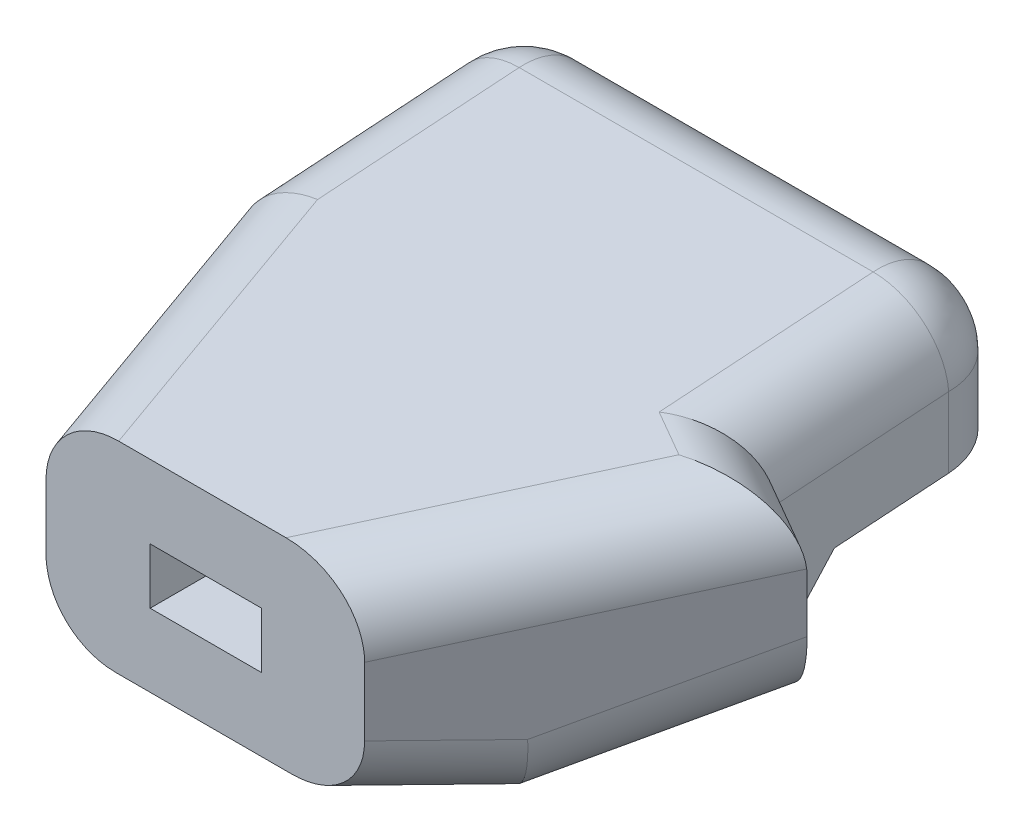
ISO-10303-21;
HEADER;
FILE_DESCRIPTION(('STEP AP214'),'2;1');
FILE_NAME('part.step','',(''),(''),'','','');
FILE_SCHEMA(('AUTOMOTIVE_DESIGN { 1 0 10303 214 1 1 1 1 }'));
ENDSEC;
DATA;
#1=APPLICATION_CONTEXT('core data for automotive mechanical design processes');
#2=APPLICATION_PROTOCOL_DEFINITION('international standard','automotive_design',2000,#1);
#3=PRODUCT_CONTEXT('',#1,'mechanical');
#4=PRODUCT('Part','Part','',(#3));
#5=PRODUCT_RELATED_PRODUCT_CATEGORY('part','',(#4));
#6=PRODUCT_DEFINITION_FORMATION('','',#4);
#7=PRODUCT_DEFINITION_CONTEXT('part definition',#1,'design');
#8=PRODUCT_DEFINITION('design','',#6,#7);
#9=PRODUCT_DEFINITION_SHAPE('','',#8);
#10=(LENGTH_UNIT() NAMED_UNIT(*) SI_UNIT(.MILLI.,.METRE.));
#11=(NAMED_UNIT(*) PLANE_ANGLE_UNIT() SI_UNIT($,.RADIAN.));
#12=(NAMED_UNIT(*) SI_UNIT($,.STERADIAN.) SOLID_ANGLE_UNIT());
#13=UNCERTAINTY_MEASURE_WITH_UNIT(LENGTH_MEASURE(1.E-05),#10,'distance_accuracy_value','');
#14=(GEOMETRIC_REPRESENTATION_CONTEXT(3) GLOBAL_UNCERTAINTY_ASSIGNED_CONTEXT((#13)) GLOBAL_UNIT_ASSIGNED_CONTEXT((#10,
#11,#12)) REPRESENTATION_CONTEXT('',''));
#15=CARTESIAN_POINT('',(0.,0.,0.));
#16=DIRECTION('',(0.,0.,1.));
#17=DIRECTION('',(1.,0.,0.));
#18=AXIS2_PLACEMENT_3D('',#15,#16,#17);
#19=CARTESIAN_POINT('',(-44.45,48.26,-50.8));
#20=DIRECTION('',(1.,0.,0.));
#21=DIRECTION('',(0.,0.,-1.));
#22=AXIS2_PLACEMENT_3D('',#19,#20,#21);
#23=PLANE('',#22);
#24=DIRECTION('',(0.,0.741365955623749,-0.671100975891173));
#25=VECTOR('',#24,1.);
#26=CARTESIAN_POINT('',(-44.45,27.062088622232,-74.2173550484524));
#27=LINE('',#26,#25);
#28=CARTESIAN_POINT('',(-44.45,15.2004808970908,-63.4799635353998));
#29=VERTEX_POINT('',#28);
#30=CARTESIAN_POINT('',(-44.45,20.6329834358397,-68.3975858346573));
#31=VERTEX_POINT('',#30);
#32=EDGE_CURVE('E282',#29,#31,#27,.T.);
#33=ORIENTED_EDGE('',*,*,#32,.F.);
#34=CARTESIAN_POINT('',(-44.45,32.1617140550632,-93.3781587201701));
#35=DIRECTION('',(1.,0.,0.));
#36=DIRECTION('',(0.,-0.268871544476507,0.963176044433632));
#37=AXIS2_PLACEMENT_3D('',#34,#35,#36);
#38=ELLIPSE('',#37,44.0636100522988,12.7);
#39=CARTESIAN_POINT('',(-44.45,21.3334287185706,-50.8));
#40=VERTEX_POINT('',#39);
#41=EDGE_CURVE('E381',#29,#40,#38,.F.);
#42=ORIENTED_EDGE('',*,*,#41,.T.);
#43=DIRECTION('',(0.,-1.,0.));
#44=VECTOR('',#43,1.);
#45=CARTESIAN_POINT('',(-44.45,48.26,-50.8));
#46=LINE('',#45,#44);
#47=CARTESIAN_POINT('',(-44.45,32.1241080736787,-50.8));
#48=VERTEX_POINT('',#47);
#49=EDGE_CURVE('E294',#48,#40,#46,.T.);
#50=ORIENTED_EDGE('',*,*,#49,.F.);
#51=DIRECTION('',(0.,-0.0669235621427186,0.997758105369297));
#52=VECTOR('',#51,1.);
#53=CARTESIAN_POINT('',(-44.45,35.5884720618099,-102.449929239213));
#54=LINE('',#53,#52);
#55=CARTESIAN_POINT('',(-44.45,34.6796249909718,-88.9));
#56=VERTEX_POINT('',#55);
#57=EDGE_CURVE('E323',#48,#56,#54,.F.);
#58=ORIENTED_EDGE('',*,*,#57,.T.);
#59=DIRECTION('',(0.,-1.,0.));
#60=VECTOR('',#59,1.);
#61=CARTESIAN_POINT('',(-44.45,48.26,-88.9));
#62=LINE('',#61,#60);
#63=CARTESIAN_POINT('',(-44.45,22.008161027569,-88.9));
#64=VERTEX_POINT('',#63);
#65=EDGE_CURVE('E325',#56,#64,#62,.T.);
#66=ORIENTED_EDGE('',*,*,#65,.T.);
#67=DIRECTION('',(0.,0.0669235621427186,-0.997758105369297));
#68=VECTOR('',#67,1.);
#69=CARTESIAN_POINT('',(-44.45,19.5816654348561,-52.7235687438587));
#70=LINE('',#69,#68);
#71=EDGE_CURVE('E279',#31,#64,#70,.T.);
#72=ORIENTED_EDGE('',*,*,#71,.F.);
#73=EDGE_LOOP('',(#33,#42,#50,#58,#66,#72));
#74=FACE_BOUND('',#73,.T.);
#75=ADVANCED_FACE('F52',(#74),#23,.F.);
#76=CARTESIAN_POINT('',(-28.575,48.26,0.));
#77=DIRECTION('',(0.95447997803503,0.,-0.298274993135947));
#78=DIRECTION('',(-0.298274993135947,0.,-0.95447997803503));
#79=AXIS2_PLACEMENT_3D('',#76,#77,#78);
#80=PLANE('',#79);
#81=ORIENTED_EDGE('',*,*,#49,.T.);
#82=DIRECTION('',(-0.288219689329278,0.257461795372023,-0.922303005853689));
#83=VECTOR('',#82,1.);
#84=CARTESIAN_POINT('',(-35.4555907010625,13.29887434165,-22.0178902434001));
#85=LINE('',#84,#83);
#86=CARTESIAN_POINT('',(-35.1883635531592,13.0601648300568,-21.1627633701095));
#87=VERTEX_POINT('',#86);
#88=EDGE_CURVE('E385',#40,#87,#85,.F.);
#89=ORIENTED_EDGE('',*,*,#88,.T.);
#90=DIRECTION('',(-0.292654151843761,-0.193219752801737,-0.936493285900035));
#91=VECTOR('',#90,1.);
#92=CARTESIAN_POINT('',(-29.2640722899567,16.971573864201,-2.2050313278613));
#93=LINE('',#92,#91);
#94=CARTESIAN_POINT('',(-28.575,17.4265217154074,0.));
#95=VERTEX_POINT('',#94);
#96=EDGE_CURVE('E383',#87,#95,#93,.F.);
#97=ORIENTED_EDGE('',*,*,#96,.T.);
#98=DIRECTION('',(0.,-1.,0.));
#99=VECTOR('',#98,1.);
#100=CARTESIAN_POINT('',(-28.575,48.26,0.));
#101=LINE('',#100,#99);
#102=CARTESIAN_POINT('',(-28.575,28.9708344476093,0.));
#103=VERTEX_POINT('',#102);
#104=EDGE_CURVE('E291',#103,#95,#101,.T.);
#105=ORIENTED_EDGE('',*,*,#104,.F.);
#106=DIRECTION('',(0.297665602820913,-0.0638899303899297,0.952529929026922));
#107=VECTOR('',#106,1.);
#108=CARTESIAN_POINT('',(-44.6872370991244,32.4291100996618,-51.5591587171979));
#109=LINE('',#108,#107);
#110=CARTESIAN_POINT('',(-44.4474694857825,32.3776471963871,-50.791902354504));
#111=VERTEX_POINT('',#110);
#112=EDGE_CURVE('E341',#103,#111,#109,.F.);
#113=ORIENTED_EDGE('',*,*,#112,.T.);
#114=CARTESIAN_POINT('',(-31.75,29.3982233618993,-10.16));
#115=DIRECTION('',(0.95447997803503,0.,-0.298274993135947));
#116=DIRECTION('',(-0.297541229968866,0.0700998795093561,-0.952131935900371));
#117=AXIS2_PLACEMENT_3D('',#114,#115,#116);
#118=ELLIPSE('',#117,42.6738289481605,12.7);
#119=EDGE_CURVE('E343',#111,#48,#118,.F.);
#120=ORIENTED_EDGE('',*,*,#119,.T.);
#121=EDGE_LOOP('',(#81,#89,#97,#105,#113,#120));
#122=FACE_BOUND('',#121,.T.);
#123=ADVANCED_FACE('F501',(#122),#80,.F.);
#124=CARTESIAN_POINT('',(28.575,48.26,0.));
#125=DIRECTION('',(0.,0.,-1.));
#126=DIRECTION('',(-1.,0.,0.));
#127=AXIS2_PLACEMENT_3D('',#124,#125,#126);
#128=PLANE('',#127);
#129=DIRECTION('',(0.,1.,0.));
#130=VECTOR('',#129,1.);
#131=CARTESIAN_POINT('',(10.1041684211454,0.,0.));
#132=LINE('',#131,#130);
#133=CARTESIAN_POINT('',(10.1041684211454,18.3063755872149,0.));
#134=VERTEX_POINT('',#133);
#135=CARTESIAN_POINT('',(10.1041684211454,28.3063755872149,0.));
#136=VERTEX_POINT('',#135);
#137=EDGE_CURVE('E246',#134,#136,#132,.T.);
#138=ORIENTED_EDGE('',*,*,#137,.F.);
#139=DIRECTION('',(1.,0.,0.));
#140=VECTOR('',#139,1.);
#141=CARTESIAN_POINT('',(0.,18.3063755872149,0.));
#142=LINE('',#141,#140);
#143=CARTESIAN_POINT('',(-9.89583157885465,18.3063755872149,0.));
#144=VERTEX_POINT('',#143);
#145=EDGE_CURVE('E69',#144,#134,#142,.T.);
#146=ORIENTED_EDGE('',*,*,#145,.F.);
#147=DIRECTION('',(0.,1.,0.));
#148=VECTOR('',#147,1.);
#149=CARTESIAN_POINT('',(-9.89583157885465,0.,0.));
#150=LINE('',#149,#148);
#151=CARTESIAN_POINT('',(-9.89583157885465,28.3063755872149,0.));
#152=VERTEX_POINT('',#151);
#153=EDGE_CURVE('E237',#144,#152,#150,.T.);
#154=ORIENTED_EDGE('',*,*,#153,.T.);
#155=DIRECTION('',(1.,0.,0.));
#156=VECTOR('',#155,1.);
#157=CARTESIAN_POINT('',(0.,28.3063755872149,0.));
#158=LINE('',#157,#156);
#159=EDGE_CURVE('E240',#152,#136,#158,.T.);
#160=ORIENTED_EDGE('',*,*,#159,.T.);
#161=EDGE_LOOP('',(#138,#146,#154,#160));
#162=FACE_BOUND('',#161,.T.);
#163=ORIENTED_EDGE('',*,*,#104,.T.);
#164=CARTESIAN_POINT('',(-15.2693253999468,18.2080908847934,0.));
#165=DIRECTION('',(0.,0.,-1.));
#166=DIRECTION('',(0.834520233187556,0.550977295721509,0.));
#167=AXIS2_PLACEMENT_3D('',#164,#165,#166);
#168=ELLIPSE('',#167,13.5612290992502,12.7);
#169=CARTESIAN_POINT('',(-16.0712770544389,5.24059466848969,0.));
#170=VERTEX_POINT('',#169);
#171=EDGE_CURVE('E397',#95,#170,#168,.F.);
#172=ORIENTED_EDGE('',*,*,#171,.T.);
#173=DIRECTION('',(-1.,0.,0.));
#174=VECTOR('',#173,1.);
#175=CARTESIAN_POINT('',(82.55,5.24059466848969,0.));
#176=LINE('',#175,#174);
#177=CARTESIAN_POINT('',(15.4471999259788,5.24059466848969,0.));
#178=VERTEX_POINT('',#177);
#179=EDGE_CURVE('E255',#178,#170,#176,.T.);
#180=ORIENTED_EDGE('',*,*,#179,.F.);
#181=CARTESIAN_POINT('',(14.0036869478931,18.2080908847934,0.));
#182=DIRECTION('',(0.,0.,-1.));
#183=DIRECTION('',(0.938837131961839,-0.344361495596806,0.));
#184=AXIS2_PLACEMENT_3D('',#181,#182,#183);
#185=ELLIPSE('',#184,14.8050370544065,12.7);
#186=CARTESIAN_POINT('',(28.575,16.9234606655006,0.));
#187=VERTEX_POINT('',#186);
#188=EDGE_CURVE('E395',#178,#187,#185,.F.);
#189=ORIENTED_EDGE('',*,*,#188,.T.);
#190=DIRECTION('',(0.,-1.,0.));
#191=VECTOR('',#190,1.);
#192=CARTESIAN_POINT('',(28.575,48.26,0.));
#193=LINE('',#192,#191);
#194=CARTESIAN_POINT('',(28.575,29.1343758145459,0.));
#195=VERTEX_POINT('',#194);
#196=EDGE_CURVE('E289',#195,#187,#193,.T.);
#197=ORIENTED_EDGE('',*,*,#196,.F.);
#198=CARTESIAN_POINT('',(14.0036869478931,28.7167521839545,0.));
#199=DIRECTION('',(0.,0.,-1.));
#200=DIRECTION('',(-0.992965534941179,-0.118403743264215,0.));
#201=AXIS2_PLACEMENT_3D('',#198,#199,#200);
#202=ELLIPSE('',#201,14.5961910681332,12.7);
#203=CARTESIAN_POINT('',(14.4817721449502,41.4452882205517,0.));
#204=VERTEX_POINT('',#203);
#205=EDGE_CURVE('E319',#195,#204,#202,.F.);
#206=ORIENTED_EDGE('',*,*,#205,.T.);
#207=DIRECTION('',(-1.,0.,0.));
#208=VECTOR('',#207,1.);
#209=CARTESIAN_POINT('',(82.55,41.4452882205517,0.));
#210=LINE('',#209,#208);
#211=CARTESIAN_POINT('',(-15.5349282872007,41.4452882205517,0.));
#212=VERTEX_POINT('',#211);
#213=EDGE_CURVE('E271',#204,#212,#210,.T.);
#214=ORIENTED_EDGE('',*,*,#213,.T.);
#215=CARTESIAN_POINT('',(-15.2693253999468,28.7167521839545,0.));
#216=DIRECTION('',(0.,0.,-1.));
#217=DIRECTION('',(-0.977732072803991,0.209857079486041,0.));
#218=AXIS2_PLACEMENT_3D('',#215,#216,#217);
#219=ELLIPSE('',#218,13.3329143924895,12.7);
#220=EDGE_CURVE('E317',#212,#103,#219,.F.);
#221=ORIENTED_EDGE('',*,*,#220,.T.);
#222=EDGE_LOOP('',(#163,#172,#180,#189,#197,#206,#214,#221));
#223=FACE_BOUND('',#222,.T.);
#224=ADVANCED_FACE('F420',(#162,#223),#128,.F.);
#225=CARTESIAN_POINT('',(57.15,48.26,-50.8));
#226=DIRECTION('',(-0.871575537124549,0.,-0.490261239632559));
#227=DIRECTION('',(-0.490261239632559,0.,0.871575537124549));
#228=AXIS2_PLACEMENT_3D('',#225,#226,#227);
#229=PLANE('',#228);
#230=DIRECTION('',(-0.482521588682802,0.176986881195609,0.857816157658315));
#231=VECTOR('',#230,1.);
#232=CARTESIAN_POINT('',(43.8602166520565,11.3169077420727,-27.1737184925448));
#233=LINE('',#232,#231);
#234=CARTESIAN_POINT('',(39.1075526472764,13.0601648300568,-18.7245380396025));
#235=VERTEX_POINT('',#234);
#236=EDGE_CURVE('E77',#187,#235,#233,.F.);
#237=ORIENTED_EDGE('',*,*,#236,.T.);
#238=DIRECTION('',(-0.476364625502872,-0.23640472157252,0.84687044533844));
#239=VECTOR('',#238,1.);
#240=CARTESIAN_POINT('',(55.4693780752367,21.1800221360687,-47.8122276893097));
#241=LINE('',#240,#239);
#242=CARTESIAN_POINT('',(57.15,22.0140617286873,-50.8));
#243=VERTEX_POINT('',#242);
#244=EDGE_CURVE('E61',#235,#243,#241,.F.);
#245=ORIENTED_EDGE('',*,*,#244,.T.);
#246=DIRECTION('',(0.,-1.,0.));
#247=VECTOR('',#246,1.);
#248=CARTESIAN_POINT('',(57.15,48.26,-50.8));
#249=LINE('',#248,#247);
#250=CARTESIAN_POINT('',(57.15,31.3816660637385,-50.8));
#251=VERTEX_POINT('',#250);
#252=EDGE_CURVE('E286',#251,#243,#249,.T.);
#253=ORIENTED_EDGE('',*,*,#252,.F.);
#254=CARTESIAN_POINT('',(50.9236822566665,31.3816660637385,-39.7309906785182));
#255=DIRECTION('',(-0.871575537124549,0.,-0.490261239632559));
#256=DIRECTION('',(0.,-1.,0.));
#257=AXIS2_PLACEMENT_3D('',#254,#255,#256);
#258=ELLIPSE('',#257,12.7068646603648,12.7);
#259=CARTESIAN_POINT('',(57.1241369132409,32.5386477238328,-50.754021179095));
#260=VERTEX_POINT('',#259);
#261=EDGE_CURVE('E313',#251,#260,#258,.F.);
#262=ORIENTED_EDGE('',*,*,#261,.T.);
#263=DIRECTION('',(0.489425629375078,0.0583603604840991,-0.870090007777917));
#264=VECTOR('',#263,1.);
#265=CARTESIAN_POINT('',(28.9266372824396,29.1763059410679,-0.625132946559234));
#266=LINE('',#265,#264);
#267=EDGE_CURVE('E315',#260,#195,#266,.F.);
#268=ORIENTED_EDGE('',*,*,#267,.T.);
#269=ORIENTED_EDGE('',*,*,#196,.T.);
#270=EDGE_LOOP('',(#237,#245,#253,#262,#268,#269));
#271=FACE_BOUND('',#270,.T.);
#272=ADVANCED_FACE('F475',(#271),#229,.F.);
#273=CARTESIAN_POINT('',(57.15,48.26,-50.8));
#274=DIRECTION('',(-0.490261239632559,0.,0.871575537124549));
#275=DIRECTION('',(0.871575537124549,0.,0.490261239632559));
#276=AXIS2_PLACEMENT_3D('',#273,#274,#275);
#277=PLANE('',#276);
#278=ORIENTED_EDGE('',*,*,#252,.T.);
#279=CARTESIAN_POINT('',(46.0809906785182,22.0140617286873,-57.0263177433335));
#280=DIRECTION('',(-0.490261239632559,0.,0.871575537124549));
#281=DIRECTION('',(0.,1.,0.));
#282=AXIS2_PLACEMENT_3D('',#279,#280,#281);
#283=ELLIPSE('',#282,13.0704872066449,12.7);
#284=CARTESIAN_POINT('',(44.6219037926469,9.0576272161988,-57.8470541166361));
#285=VERTEX_POINT('',#284);
#286=EDGE_CURVE('E12',#243,#285,#283,.F.);
#287=ORIENTED_EDGE('',*,*,#286,.T.);
#288=DIRECTION('',(0.863526210364251,-0.13559298459543,0.485733493329891));
#289=VECTOR('',#288,1.);
#290=CARTESIAN_POINT('',(52.329534026568,7.84735638129908,-53.5115121100555));
#291=LINE('',#290,#289);
#292=CARTESIAN_POINT('',(44.45,9.08461996758088,-57.94375));
#293=VERTEX_POINT('',#292);
#294=EDGE_CURVE('E258',#293,#285,#291,.T.);
#295=ORIENTED_EDGE('',*,*,#294,.F.);
#296=DIRECTION('',(0.,-1.,0.));
#297=VECTOR('',#296,1.);
#298=CARTESIAN_POINT('',(44.45,48.26,-57.94375));
#299=LINE('',#298,#297);
#300=CARTESIAN_POINT('',(44.45,31.8608254857309,-57.94375));
#301=VERTEX_POINT('',#300);
#302=EDGE_CURVE('E284',#301,#293,#299,.T.);
#303=ORIENTED_EDGE('',*,*,#302,.F.);
#304=DIRECTION('',(-0.871104683754771,0.0328659855718789,-0.489996384612059));
#305=VECTOR('',#304,1.);
#306=CARTESIAN_POINT('',(56.76432975166,31.3962170506104,-51.0169395146912));
#307=LINE('',#306,#305);
#308=EDGE_CURVE('E321',#301,#251,#307,.F.);
#309=ORIENTED_EDGE('',*,*,#308,.T.);
#310=EDGE_LOOP('',(#278,#287,#295,#303,#309));
#311=FACE_BOUND('',#310,.T.);
#312=ADVANCED_FACE('F471',(#311),#277,.F.);
#313=CARTESIAN_POINT('',(44.45,48.26,-57.94375));
#314=DIRECTION('',(-1.,0.,0.));
#315=DIRECTION('',(0.,0.,1.));
#316=AXIS2_PLACEMENT_3D('',#313,#314,#315);
#317=PLANE('',#316);
#318=DIRECTION('',(0.,-0.0669235621427186,0.997758105369297));
#319=VECTOR('',#318,1.);
#320=CARTESIAN_POINT('',(44.45,20.0586788152768,-59.835323579464));
#321=LINE('',#320,#319);
#322=CARTESIAN_POINT('',(44.45,22.008161027569,-88.9));
#323=VERTEX_POINT('',#322);
#324=CARTESIAN_POINT('',(44.45,20.6329834358397,-68.3975858346573));
#325=VERTEX_POINT('',#324);
#326=EDGE_CURVE('E277',#323,#325,#321,.T.);
#327=ORIENTED_EDGE('',*,*,#326,.F.);
#328=DIRECTION('',(0.,-1.,0.));
#329=VECTOR('',#328,1.);
#330=CARTESIAN_POINT('',(44.45,48.26,-88.9));
#331=LINE('',#330,#329);
#332=CARTESIAN_POINT('',(44.45,34.6796249909718,-88.9));
#333=VERTEX_POINT('',#332);
#334=EDGE_CURVE('E339',#323,#333,#331,.F.);
#335=ORIENTED_EDGE('',*,*,#334,.T.);
#336=DIRECTION('',(0.,0.0669235621427186,-0.997758105369297));
#337=VECTOR('',#336,1.);
#338=CARTESIAN_POINT('',(44.45,32.6602755940782,-58.7936792392125));
#339=LINE('',#338,#337);
#340=CARTESIAN_POINT('',(44.45,32.6016034681345,-57.9189411448069));
#341=VERTEX_POINT('',#340);
#342=EDGE_CURVE('E337',#333,#341,#339,.F.);
#343=ORIENTED_EDGE('',*,*,#342,.T.);
#344=CARTESIAN_POINT('',(44.45,31.6259121935233,-43.3724369478931));
#345=DIRECTION('',(-1.,0.,0.));
#346=DIRECTION('',(0.,-0.0669235621427186,0.997758105369297));
#347=AXIS2_PLACEMENT_3D('',#344,#345,#346);
#348=ELLIPSE('',#347,14.5791892029078,12.7);
#349=EDGE_CURVE('E345',#341,#301,#348,.T.);
#350=ORIENTED_EDGE('',*,*,#349,.T.);
#351=ORIENTED_EDGE('',*,*,#302,.T.);
#352=DIRECTION('',(0.,-0.741365955623749,0.671100975891173));
#353=VECTOR('',#352,1.);
#354=CARTESIAN_POINT('',(44.45,30.616328677508,-77.4347323120743));
#355=LINE('',#354,#353);
#356=EDGE_CURVE('E297',#325,#293,#355,.T.);
#357=ORIENTED_EDGE('',*,*,#356,.F.);
#358=EDGE_LOOP('',(#327,#335,#343,#350,#351,#357));
#359=FACE_BOUND('',#358,.T.);
#360=ADVANCED_FACE('F464',(#359),#317,.F.);
#361=CARTESIAN_POINT('',(-44.45,48.26,-101.6));
#362=DIRECTION('',(0.,0.,1.));
#363=DIRECTION('',(1.,0.,0.));
#364=AXIS2_PLACEMENT_3D('',#361,#362,#363);
#365=PLANE('',#364);
#366=DIRECTION('',(-1.,0.,0.));
#367=VECTOR('',#366,1.);
#368=CARTESIAN_POINT('',(82.55,22.86,-101.6));
#369=LINE('',#368,#367);
#370=CARTESIAN_POINT('',(31.75,22.86,-101.6));
#371=VERTEX_POINT('',#370);
#372=CARTESIAN_POINT('',(-31.75,22.86,-101.6));
#373=VERTEX_POINT('',#372);
#374=EDGE_CURVE('E268',#371,#373,#369,.T.);
#375=ORIENTED_EDGE('',*,*,#374,.T.);
#376=DIRECTION('',(0.,-1.,0.));
#377=VECTOR('',#376,1.);
#378=CARTESIAN_POINT('',(-31.75,48.26,-101.6));
#379=LINE('',#378,#377);
#380=CARTESIAN_POINT('',(-31.75,34.6796249909718,-101.6));
#381=VERTEX_POINT('',#380);
#382=EDGE_CURVE('E335',#373,#381,#379,.F.);
#383=ORIENTED_EDGE('',*,*,#382,.T.);
#384=DIRECTION('',(-1.,0.,0.));
#385=VECTOR('',#384,1.);
#386=CARTESIAN_POINT('',(44.45,34.6796249909718,-101.6));
#387=LINE('',#386,#385);
#388=CARTESIAN_POINT('',(31.75,34.6796249909718,-101.6));
#389=VERTEX_POINT('',#388);
#390=EDGE_CURVE('E331',#381,#389,#387,.F.);
#391=ORIENTED_EDGE('',*,*,#390,.T.);
#392=DIRECTION('',(0.,-1.,0.));
#393=VECTOR('',#392,1.);
#394=CARTESIAN_POINT('',(31.75,48.26,-101.6));
#395=LINE('',#394,#393);
#396=EDGE_CURVE('E333',#389,#371,#395,.T.);
#397=ORIENTED_EDGE('',*,*,#396,.T.);
#398=EDGE_LOOP('',(#375,#383,#391,#397));
#399=FACE_BOUND('',#398,.T.);
#400=ADVANCED_FACE('F452',(#399),#365,.F.);
#401=CARTESIAN_POINT('',(82.55,41.4452882205517,0.));
#402=DIRECTION('',(0.,0.997758105369297,0.0669235621427186));
#403=DIRECTION('',(0.,-0.0669235621427186,0.997758105369297));
#404=AXIS2_PLACEMENT_3D('',#401,#402,#403);
#405=PLANE('',#404);
#406=ORIENTED_EDGE('',*,*,#213,.F.);
#407=DIRECTION('',(0.489425629375078,0.0583603604840991,-0.870090007777917));
#408=VECTOR('',#407,1.);
#409=CARTESIAN_POINT('',(46.4326279609578,45.2551897689821,-56.8015214506802));
#410=LINE('',#409,#408);
#411=CARTESIAN_POINT('',(39.8546729351847,44.4708176325199,-45.1073791826392));
#412=VERTEX_POINT('',#411);
#413=EDGE_CURVE('E310',#204,#412,#410,.T.);
#414=ORIENTED_EDGE('',*,*,#413,.T.);
#415=DIRECTION('',(-0.871104683754771,0.0328659855718789,-0.489996384612059));
#416=VECTOR('',#415,1.);
#417=CARTESIAN_POINT('',(37.8380120083265,44.546904410793,-46.2417509539969));
#418=LINE('',#417,#416);
#419=CARTESIAN_POINT('',(31.75,44.7765995537058,-49.6662577086806));
#420=VERTEX_POINT('',#419);
#421=EDGE_CURVE('E308',#412,#420,#418,.T.);
#422=ORIENTED_EDGE('',*,*,#421,.T.);
#423=DIRECTION('',(0.,0.0669235621427186,-0.997758105369297));
#424=VECTOR('',#423,1.);
#425=CARTESIAN_POINT('',(31.75,48.26,-101.6));
#426=LINE('',#425,#424);
#427=CARTESIAN_POINT('',(31.75,47.3511529291619,-88.0500707607874));
#428=VERTEX_POINT('',#427);
#429=EDGE_CURVE('E306',#420,#428,#426,.T.);
#430=ORIENTED_EDGE('',*,*,#429,.T.);
#431=DIRECTION('',(-1.,0.,0.));
#432=VECTOR('',#431,1.);
#433=CARTESIAN_POINT('',(-44.45,47.3511529291619,-88.0500707607874));
#434=LINE('',#433,#432);
#435=CARTESIAN_POINT('',(-31.75,47.3511529291619,-88.0500707607874));
#436=VERTEX_POINT('',#435);
#437=EDGE_CURVE('E304',#428,#436,#434,.T.);
#438=ORIENTED_EDGE('',*,*,#437,.T.);
#439=DIRECTION('',(0.,-0.0669235621427186,0.997758105369297));
#440=VECTOR('',#439,1.);
#441=CARTESIAN_POINT('',(-31.75,44.8526441102758,-50.8));
#442=LINE('',#441,#440);
#443=CARTESIAN_POINT('',(-31.75,44.9256359435694,-51.8882294809576));
#444=VERTEX_POINT('',#443);
#445=EDGE_CURVE('E302',#436,#444,#442,.T.);
#446=ORIENTED_EDGE('',*,*,#445,.T.);
#447=DIRECTION('',(0.297665602820913,-0.0638899303899297,0.952529929026922));
#448=VECTOR('',#447,1.);
#449=CARTESIAN_POINT('',(-16.6903413780795,41.6932821481277,-3.69732189081193));
#450=LINE('',#449,#448);
#451=EDGE_CURVE('E300',#444,#212,#450,.T.);
#452=ORIENTED_EDGE('',*,*,#451,.T.);
#453=EDGE_LOOP('',(#406,#414,#422,#430,#438,#446,#452));
#454=FACE_BOUND('',#453,.T.);
#455=ADVANCED_FACE('F489',(#454),#405,.T.);
#456=CARTESIAN_POINT('',(82.55,9.08461996758088,-57.94375));
#457=DIRECTION('',(0.,-0.671100975891173,-0.741365955623749));
#458=DIRECTION('',(0.,0.741365955623749,-0.671100975891173));
#459=AXIS2_PLACEMENT_3D('',#456,#457,#458);
#460=PLANE('',#459);
#461=DIRECTION('',(-1.,0.,0.));
#462=VECTOR('',#461,1.);
#463=CARTESIAN_POINT('',(82.55,9.08461996758088,-57.94375));
#464=LINE('',#463,#462);
#465=CARTESIAN_POINT('',(-32.3096633328057,9.08461996758088,-57.94375));
#466=VERTEX_POINT('',#465);
#467=EDGE_CURVE('E262',#293,#466,#464,.T.);
#468=ORIENTED_EDGE('',*,*,#467,.T.);
#469=CARTESIAN_POINT('',(-38.3679436075628,26.7287154906875,-73.9155782643712));
#470=DIRECTION('',(0.,-0.671100975891173,-0.741365955623749));
#471=DIRECTION('',(0.335298286231136,-0.69844977841403,0.632252296384803));
#472=AXIS2_PLACEMENT_3D('',#469,#470,#471);
#473=ELLIPSE('',#472,24.8541439853702,12.7);
#474=EDGE_CURVE('E379',#466,#29,#473,.T.);
#475=ORIENTED_EDGE('',*,*,#474,.T.);
#476=ORIENTED_EDGE('',*,*,#32,.T.);
#477=DIRECTION('',(-1.,0.,0.));
#478=VECTOR('',#477,1.);
#479=CARTESIAN_POINT('',(82.55,20.6329834358397,-68.3975858346573));
#480=LINE('',#479,#478);
#481=EDGE_CURVE('E265',#325,#31,#480,.T.);
#482=ORIENTED_EDGE('',*,*,#481,.F.);
#483=ORIENTED_EDGE('',*,*,#356,.T.);
#484=EDGE_LOOP('',(#468,#475,#476,#482,#483));
#485=FACE_BOUND('',#484,.T.);
#486=ADVANCED_FACE('F435',(#485),#460,.T.);
#487=CARTESIAN_POINT('',(82.55,20.6329834358397,-68.3975858346573));
#488=DIRECTION('',(0.,-0.997758105369297,-0.0669235621427186));
#489=DIRECTION('',(0.,0.0669235621427186,-0.997758105369297));
#490=AXIS2_PLACEMENT_3D('',#487,#488,#489);
#491=PLANE('',#490);
#492=ORIENTED_EDGE('',*,*,#71,.T.);
#493=CARTESIAN_POINT('',(-31.75,22.008161027569,-88.9));
#494=DIRECTION('',(0.,-0.997758105369297,-0.0669235621427186));
#495=DIRECTION('',(0.,-0.0669235621427186,0.997758105369297));
#496=AXIS2_PLACEMENT_3D('',#493,#494,#495);
#497=ELLIPSE('',#496,12.7285360365972,12.7);
#498=EDGE_CURVE('E329',#64,#373,#497,.T.);
#499=ORIENTED_EDGE('',*,*,#498,.T.);
#500=ORIENTED_EDGE('',*,*,#374,.F.);
#501=CARTESIAN_POINT('',(31.75,22.008161027569,-88.9));
#502=DIRECTION('',(0.,-0.997758105369297,-0.0669235621427186));
#503=DIRECTION('',(0.,-0.0669235621427186,0.997758105369297));
#504=AXIS2_PLACEMENT_3D('',#501,#502,#503);
#505=ELLIPSE('',#504,12.7285360365972,12.7);
#506=EDGE_CURVE('E327',#371,#323,#505,.T.);
#507=ORIENTED_EDGE('',*,*,#506,.T.);
#508=ORIENTED_EDGE('',*,*,#326,.T.);
#509=ORIENTED_EDGE('',*,*,#481,.T.);
#510=EDGE_LOOP('',(#492,#499,#500,#507,#508,#509));
#511=FACE_BOUND('',#510,.T.);
#512=ADVANCED_FACE('F443',(#511),#491,.T.);
#513=CARTESIAN_POINT('',(82.55,5.24059466848969,0.));
#514=DIRECTION('',(0.,-0.979371791451354,0.202066558612172));
#515=DIRECTION('',(0.,-0.202066558612172,-0.979371791451354));
#516=AXIS2_PLACEMENT_3D('',#513,#514,#515);
#517=PLANE('',#516);
#518=DIRECTION('',(-0.292654151843761,-0.193219752801737,-0.936493285900035));
#519=VECTOR('',#518,1.);
#520=CARTESIAN_POINT('',(-25.0796765689118,-0.707042555720922,-28.8268784463132));
#521=LINE('',#520,#519);
#522=CARTESIAN_POINT('',(-23.9250323951995,0.0552909372881425,-25.1320170904338));
#523=VERTEX_POINT('',#522);
#524=EDGE_CURVE('E391',#170,#523,#521,.T.);
#525=ORIENTED_EDGE('',*,*,#524,.T.);
#526=CARTESIAN_POINT('',(-14.7192735444232,5.60375672473534,1.76016593767556));
#527=DIRECTION('',(0.,-0.979371791451354,0.202066558612172));
#528=DIRECTION('',(0.320699245528422,0.191393620749627,0.927642428877554));
#529=AXIS2_PLACEMENT_3D('',#526,#527,#528);
#530=ELLIPSE('',#529,28.9612215845353,12.7);
#531=CARTESIAN_POINT('',(-22.1397414578057,0.,-25.4));
#532=VERTEX_POINT('',#531);
#533=EDGE_CURVE('E393',#523,#532,#530,.T.);
#534=ORIENTED_EDGE('',*,*,#533,.T.);
#535=DIRECTION('',(-1.,0.,0.));
#536=VECTOR('',#535,1.);
#537=CARTESIAN_POINT('',(82.55,0.,-25.4));
#538=LINE('',#537,#536);
#539=CARTESIAN_POINT('',(26.3704358520391,0.,-25.4));
#540=VERTEX_POINT('',#539);
#541=EDGE_CURVE('E259',#540,#532,#538,.T.);
#542=ORIENTED_EDGE('',*,*,#541,.F.);
#543=CARTESIAN_POINT('',(13.0135936079506,5.60375672473534,1.76016593767556));
#544=DIRECTION('',(0.,-0.979371791451354,0.202066558612172));
#545=DIRECTION('',(0.520416304141384,-0.172547197232235,-0.83629799420489));
#546=AXIS2_PLACEMENT_3D('',#543,#544,#545);
#547=ELLIPSE('',#546,31.5408594875889,12.7);
#548=CARTESIAN_POINT('',(29.3273892594226,0.149399832551079,-24.6758921483445));
#549=VERTEX_POINT('',#548);
#550=EDGE_CURVE('E389',#540,#549,#547,.T.);
#551=ORIENTED_EDGE('',*,*,#550,.T.);
#552=DIRECTION('',(-0.482521588682802,0.176986881195609,0.857816157658315));
#553=VECTOR('',#552,1.);
#554=CARTESIAN_POINT('',(18.5037073305747,4.11948065913016,-5.43379094150374));
#555=LINE('',#554,#553);
#556=EDGE_CURVE('E387',#549,#178,#555,.T.);
#557=ORIENTED_EDGE('',*,*,#556,.T.);
#558=ORIENTED_EDGE('',*,*,#179,.T.);
#559=EDGE_LOOP('',(#525,#534,#542,#551,#557,#558));
#560=FACE_BOUND('',#559,.T.);
#561=ADVANCED_FACE('F416',(#560),#517,.T.);
#562=CARTESIAN_POINT('',(82.55,0.,-25.4));
#563=DIRECTION('',(0.,-0.963176044433632,-0.268871544476507));
#564=DIRECTION('',(0.,0.268871544476507,-0.963176044433632));
#565=AXIS2_PLACEMENT_3D('',#562,#563,#564);
#566=PLANE('',#565);
#567=ORIENTED_EDGE('',*,*,#541,.T.);
#568=DIRECTION('',(-0.288219689329278,0.257461795372023,-0.922303005853689));
#569=VECTOR('',#568,1.);
#570=CARTESIAN_POINT('',(-31.2711949800177,8.15697367399133,-54.6206512710783));
#571=LINE('',#570,#569);
#572=EDGE_CURVE('E376',#532,#466,#571,.T.);
#573=ORIENTED_EDGE('',*,*,#572,.T.);
#574=ORIENTED_EDGE('',*,*,#467,.F.);
#575=ORIENTED_EDGE('',*,*,#294,.T.);
#576=DIRECTION('',(-0.476364625502872,-0.23640472157252,0.84687044533844));
#577=VECTOR('',#576,1.);
#578=CARTESIAN_POINT('',(30.1128687537549,1.85725127511308,-32.0532140474948));
#579=LINE('',#578,#577);
#580=EDGE_CURVE('E347',#285,#540,#579,.T.);
#581=ORIENTED_EDGE('',*,*,#580,.T.);
#582=EDGE_LOOP('',(#567,#573,#574,#575,#581));
#583=FACE_BOUND('',#582,.T.);
#584=ADVANCED_FACE('F429',(#583),#566,.T.);
#585=CARTESIAN_POINT('',(-6.84413174428775,26.908397335156,26.960619698109));
#586=DIRECTION('',(-0.297665602820913,0.0638899303899297,-0.952529929026922));
#587=DIRECTION('',(-0.95447997803503,0.,0.298274993135947));
#588=AXIS2_PLACEMENT_3D('',#585,#586,#587);
#589=CYLINDRICAL_SURFACE('',#588,12.7);
#590=ORIENTED_EDGE('',*,*,#220,.F.);
#591=ORIENTED_EDGE('',*,*,#451,.F.);
#592=CARTESIAN_POINT('',(-31.75,32.2541080053793,-52.7381587201701));
#593=DIRECTION('',(-0.150548664855925,0.0661608074943721,-0.986386256525197));
#594=DIRECTION('',(-0.988602599384656,-0.0100752529279888,0.150211150612525));
#595=AXIS2_PLACEMENT_3D('',#592,#593,#594);
#596=ELLIPSE('',#595,12.8464157467368,12.7);
#597=EDGE_CURVE('E274',#111,#444,#596,.T.);
#598=ORIENTED_EDGE('',*,*,#597,.F.);
#599=ORIENTED_EDGE('',*,*,#112,.F.);
#600=EDGE_LOOP('',(#590,#591,#598,#599));
#601=FACE_BOUND('',#600,.T.);
#602=ADVANCED_FACE('F494',(#601),#589,.T.);
#603=CARTESIAN_POINT('',(-31.75,28.7737602823616,-0.849929239212519));
#604=DIRECTION('',(0.,0.0669235621427186,-0.997758105369297));
#605=DIRECTION('',(0.,0.997758105369297,0.0669235621427186));
#606=AXIS2_PLACEMENT_3D('',#603,#604,#605);
#607=CYLINDRICAL_SURFACE('',#606,12.7);
#608=ORIENTED_EDGE('',*,*,#597,.T.);
#609=ORIENTED_EDGE('',*,*,#445,.F.);
#610=CARTESIAN_POINT('',(-31.75,34.6796249909718,-88.9));
#611=DIRECTION('',(0.,0.0669235621427195,-0.997758105369297));
#612=DIRECTION('',(0.,0.997758105369297,0.0669235621427195));
#613=AXIS2_PLACEMENT_3D('',#610,#611,#612);
#614=CIRCLE('',#613,12.7);
#615=EDGE_CURVE('E369',#56,#436,#614,.T.);
#616=ORIENTED_EDGE('',*,*,#615,.F.);
#617=ORIENTED_EDGE('',*,*,#57,.F.);
#618=ORIENTED_EDGE('',*,*,#119,.F.);
#619=EDGE_LOOP('',(#608,#609,#616,#617,#618));
#620=FACE_BOUND('',#619,.T.);
#621=ADVANCED_FACE('F498',(#620),#607,.T.);
#622=CARTESIAN_POINT('',(-31.75,48.26,-88.9));
#623=DIRECTION('',(0.,-1.,0.));
#624=DIRECTION('',(0.,0.,-1.));
#625=AXIS2_PLACEMENT_3D('',#622,#623,#624);
#626=CYLINDRICAL_SURFACE('',#625,12.7);
#627=ORIENTED_EDGE('',*,*,#498,.F.);
#628=ORIENTED_EDGE('',*,*,#65,.F.);
#629=CARTESIAN_POINT('',(-31.75,34.6796249909718,-88.9));
#630=DIRECTION('',(0.,1.,0.));
#631=DIRECTION('',(0.,0.,1.));
#632=AXIS2_PLACEMENT_3D('',#629,#630,#631);
#633=CIRCLE('',#632,12.7);
#634=EDGE_CURVE('E366',#381,#56,#633,.T.);
#635=ORIENTED_EDGE('',*,*,#634,.F.);
#636=ORIENTED_EDGE('',*,*,#382,.F.);
#637=EDGE_LOOP('',(#627,#628,#635,#636));
#638=FACE_BOUND('',#637,.T.);
#639=ADVANCED_FACE('F447',(#638),#626,.T.);
#640=CARTESIAN_POINT('',(-31.75,34.6796249909718,-88.9));
#641=DIRECTION('',(0.,0.,1.));
#642=DIRECTION('',(1.,0.,0.));
#643=AXIS2_PLACEMENT_3D('',#640,#641,#642);
#644=SPHERICAL_SURFACE('',#643,12.7);
#645=ORIENTED_EDGE('',*,*,#634,.T.);
#646=ORIENTED_EDGE('',*,*,#615,.T.);
#647=CARTESIAN_POINT('',(-31.75,34.6796249909718,-88.9));
#648=DIRECTION('',(-1.,0.,0.));
#649=DIRECTION('',(0.,0.,1.));
#650=AXIS2_PLACEMENT_3D('',#647,#648,#649);
#651=CIRCLE('',#650,12.7);
#652=EDGE_CURVE('E363',#381,#436,#651,.F.);
#653=ORIENTED_EDGE('',*,*,#652,.F.);
#654=EDGE_LOOP('',(#645,#646,#653));
#655=FACE_BOUND('',#654,.T.);
#656=ADVANCED_FACE('F531',(#655),#644,.T.);
#657=CARTESIAN_POINT('',(82.55,34.6796249909718,-88.9));
#658=DIRECTION('',(1.,0.,0.));
#659=DIRECTION('',(0.,1.,0.));
#660=AXIS2_PLACEMENT_3D('',#657,#658,#659);
#661=CYLINDRICAL_SURFACE('',#660,12.7);
#662=ORIENTED_EDGE('',*,*,#652,.T.);
#663=ORIENTED_EDGE('',*,*,#437,.F.);
#664=CARTESIAN_POINT('',(31.75,34.6796249909718,-88.9));
#665=DIRECTION('',(1.,0.,0.));
#666=DIRECTION('',(0.,1.,0.));
#667=AXIS2_PLACEMENT_3D('',#664,#665,#666);
#668=CIRCLE('',#667,12.7);
#669=EDGE_CURVE('E360',#389,#428,#668,.T.);
#670=ORIENTED_EDGE('',*,*,#669,.F.);
#671=ORIENTED_EDGE('',*,*,#390,.F.);
#672=EDGE_LOOP('',(#662,#663,#670,#671));
#673=FACE_BOUND('',#672,.T.);
#674=ADVANCED_FACE('F528',(#673),#661,.T.);
#675=CARTESIAN_POINT('',(31.75,48.26,-88.9));
#676=DIRECTION('',(0.,-1.,0.));
#677=DIRECTION('',(0.,0.,-1.));
#678=AXIS2_PLACEMENT_3D('',#675,#676,#677);
#679=CYLINDRICAL_SURFACE('',#678,12.7);
#680=ORIENTED_EDGE('',*,*,#506,.F.);
#681=ORIENTED_EDGE('',*,*,#396,.F.);
#682=CARTESIAN_POINT('',(31.75,34.6796249909718,-88.9));
#683=DIRECTION('',(0.,1.,0.));
#684=DIRECTION('',(0.,0.,1.));
#685=AXIS2_PLACEMENT_3D('',#682,#683,#684);
#686=CIRCLE('',#685,12.7);
#687=EDGE_CURVE('E357',#333,#389,#686,.T.);
#688=ORIENTED_EDGE('',*,*,#687,.F.);
#689=ORIENTED_EDGE('',*,*,#334,.F.);
#690=EDGE_LOOP('',(#680,#681,#688,#689));
#691=FACE_BOUND('',#690,.T.);
#692=ADVANCED_FACE('F459',(#691),#679,.T.);
#693=CARTESIAN_POINT('',(31.75,34.6796249909718,-88.9));
#694=DIRECTION('',(0.,0.,1.));
#695=DIRECTION('',(1.,0.,0.));
#696=AXIS2_PLACEMENT_3D('',#693,#694,#695);
#697=SPHERICAL_SURFACE('',#696,12.7);
#698=ORIENTED_EDGE('',*,*,#687,.T.);
#699=ORIENTED_EDGE('',*,*,#669,.T.);
#700=CARTESIAN_POINT('',(31.75,34.6796249909718,-88.9));
#701=DIRECTION('',(0.,0.0669235621427184,-0.997758105369297));
#702=DIRECTION('',(0.,0.997758105369297,0.0669235621427184));
#703=AXIS2_PLACEMENT_3D('',#700,#701,#702);
#704=CIRCLE('',#703,12.7);
#705=EDGE_CURVE('E354',#333,#428,#704,.F.);
#706=ORIENTED_EDGE('',*,*,#705,.F.);
#707=EDGE_LOOP('',(#698,#699,#706));
#708=FACE_BOUND('',#707,.T.);
#709=ADVANCED_FACE('F521',(#708),#697,.T.);
#710=CARTESIAN_POINT('',(31.75,28.7737602823616,-0.849929239212496));
#711=DIRECTION('',(0.,-0.0669235621427186,0.997758105369297));
#712=DIRECTION('',(0.,-0.997758105369297,-0.0669235621427186));
#713=AXIS2_PLACEMENT_3D('',#710,#711,#712);
#714=CYLINDRICAL_SURFACE('',#713,12.7);
#715=ORIENTED_EDGE('',*,*,#705,.T.);
#716=ORIENTED_EDGE('',*,*,#429,.F.);
#717=CARTESIAN_POINT('',(31.75,32.1050716155157,-50.5161869478931));
#718=DIRECTION('',(0.504431673680324,-0.0577852576254171,0.861515844653615));
#719=DIRECTION('',(0.863451612186848,0.0337583644603007,-0.503300791019544));
#720=AXIS2_PLACEMENT_3D('',#717,#718,#719);
#721=ELLIPSE('',#720,14.7084096210498,12.7);
#722=EDGE_CURVE('E350',#341,#420,#721,.T.);
#723=ORIENTED_EDGE('',*,*,#722,.F.);
#724=ORIENTED_EDGE('',*,*,#342,.F.);
#725=EDGE_LOOP('',(#715,#716,#723,#724));
#726=FACE_BOUND('',#725,.T.);
#727=ADVANCED_FACE('F518',(#726),#714,.T.);
#728=CARTESIAN_POINT('',(91.5930550317976,29.8472477053347,-16.8544684925069));
#729=DIRECTION('',(0.871104683754771,-0.0328659855718789,0.489996384612059));
#730=DIRECTION('',(0.490261239632559,0.,-0.871575537124549));
#731=AXIS2_PLACEMENT_3D('',#728,#729,#730);
#732=CYLINDRICAL_SURFACE('',#731,12.7);
#733=ORIENTED_EDGE('',*,*,#722,.T.);
#734=ORIENTED_EDGE('',*,*,#421,.F.);
#735=CARTESIAN_POINT('',(39.8546729351847,31.7992896943298,-45.9573084218517));
#736=DIRECTION('',(0.269629387342928,-0.0644449924992162,0.960805306200405));
#737=DIRECTION('',(0.962964170403592,0.0180445590593476,-0.269024906667164));
#738=AXIS2_PLACEMENT_3D('',#735,#736,#737);
#739=ELLIPSE('',#738,17.9433122146059,12.7);
#740=EDGE_CURVE('E348',#260,#412,#739,.T.);
#741=ORIENTED_EDGE('',*,*,#740,.F.);
#742=ORIENTED_EDGE('',*,*,#261,.F.);
#743=ORIENTED_EDGE('',*,*,#308,.F.);
#744=ORIENTED_EDGE('',*,*,#349,.F.);
#745=EDGE_LOOP('',(#733,#734,#741,#742,#743,#744));
#746=FACE_BOUND('',#745,.T.);
#747=ADVANCED_FACE('F479',(#746),#732,.T.);
#748=CARTESIAN_POINT('',(30.7866616460069,30.7179968973302,-29.8363994633133));
#749=DIRECTION('',(-0.489425629375078,-0.0583603604840991,0.870090007777916));
#750=DIRECTION('',(0.871575537124549,0.,0.490261239632559));
#751=AXIS2_PLACEMENT_3D('',#748,#749,#750);
#752=CYLINDRICAL_SURFACE('',#751,12.7);
#753=ORIENTED_EDGE('',*,*,#205,.F.);
#754=ORIENTED_EDGE('',*,*,#267,.F.);
#755=ORIENTED_EDGE('',*,*,#740,.T.);
#756=ORIENTED_EDGE('',*,*,#413,.F.);
#757=EDGE_LOOP('',(#753,#754,#755,#756));
#758=FACE_BOUND('',#757,.T.);
#759=ADVANCED_FACE('F485',(#758),#752,.T.);
#760=CARTESIAN_POINT('',(-7.62471452469343,23.2553106637579,24.4627548008109));
#761=DIRECTION('',(0.292654151843761,0.193219752801737,0.936493285900035));
#762=DIRECTION('',(0.95447997803503,0.,-0.298274993135947));
#763=AXIS2_PLACEMENT_3D('',#760,#761,#762);
#764=CYLINDRICAL_SURFACE('',#763,12.7);
#765=ORIENTED_EDGE('',*,*,#171,.F.);
#766=ORIENTED_EDGE('',*,*,#96,.F.);
#767=CARTESIAN_POINT('',(-23.0664678321143,13.0601648300568,-24.950855782936));
#768=DIRECTION('',(0.298112834042326,-0.0329699428995129,0.953961068935444));
#769=DIRECTION('',(0.00983410949204494,0.999456343651489,0.0314691503745435));
#770=AXIS2_PLACEMENT_3D('',#767,#768,#769);
#771=ELLIPSE('',#770,13.0356463795715,12.7);
#772=EDGE_CURVE('E351',#523,#87,#771,.F.);
#773=ORIENTED_EDGE('',*,*,#772,.F.);
#774=ORIENTED_EDGE('',*,*,#524,.F.);
#775=EDGE_LOOP('',(#765,#766,#773,#774));
#776=FACE_BOUND('',#775,.T.);
#777=ADVANCED_FACE('F426',(#776),#764,.T.);
#778=CARTESIAN_POINT('',(-13.4431029394546,4.46377501175507,5.84391187357527));
#779=DIRECTION('',(0.288219689329278,-0.257461795372023,0.922303005853689));
#780=DIRECTION('',(0.95447997803503,0.,-0.298274993135947));
#781=AXIS2_PLACEMENT_3D('',#778,#779,#780);
#782=CYLINDRICAL_SURFACE('',#781,12.7);
#783=ORIENTED_EDGE('',*,*,#772,.T.);
#784=ORIENTED_EDGE('',*,*,#88,.F.);
#785=ORIENTED_EDGE('',*,*,#41,.F.);
#786=ORIENTED_EDGE('',*,*,#474,.F.);
#787=ORIENTED_EDGE('',*,*,#572,.F.);
#788=ORIENTED_EDGE('',*,*,#533,.F.);
#789=EDGE_LOOP('',(#783,#784,#785,#786,#787,#788));
#790=FACE_BOUND('',#789,.T.);
#791=ADVANCED_FACE('F431',(#790),#782,.T.);
#792=CARTESIAN_POINT('',(31.0705491649147,11.9480378914515,-30.3410883858162));
#793=DIRECTION('',(0.482521588682802,-0.176986881195609,-0.857816157658315));
#794=DIRECTION('',(-0.871575537124549,0.,-0.490261239632559));
#795=AXIS2_PLACEMENT_3D('',#792,#793,#794);
#796=CYLINDRICAL_SURFACE('',#795,12.7);
#797=ORIENTED_EDGE('',*,*,#188,.F.);
#798=ORIENTED_EDGE('',*,*,#556,.F.);
#799=CARTESIAN_POINT('',(28.0385433257947,13.0601648300568,-24.9508557829361));
#800=DIRECTION('',(0.490035165029836,0.0303652620968621,-0.871173626719709));
#801=DIRECTION('',(0.014886911037375,-0.999538869108045,-0.0264656196220006));
#802=AXIS2_PLACEMENT_3D('',#799,#800,#801);
#803=ELLIPSE('',#802,12.9805737194045,12.7);
#804=EDGE_CURVE('E56',#235,#549,#803,.T.);
#805=ORIENTED_EDGE('',*,*,#804,.F.);
#806=ORIENTED_EDGE('',*,*,#236,.F.);
#807=EDGE_LOOP('',(#797,#798,#805,#806));
#808=FACE_BOUND('',#807,.T.);
#809=ADVANCED_FACE('F54',(#808),#796,.T.);
#810=CARTESIAN_POINT('',(39.1188854933401,18.5589887661994,-44.6492418585723));
#811=DIRECTION('',(0.476364625502872,0.23640472157252,-0.84687044533844));
#812=DIRECTION('',(-0.871575537124549,0.,-0.490261239632559));
#813=AXIS2_PLACEMENT_3D('',#810,#811,#812);
#814=CYLINDRICAL_SURFACE('',#813,12.7);
#815=ORIENTED_EDGE('',*,*,#286,.F.);
#816=ORIENTED_EDGE('',*,*,#244,.F.);
#817=ORIENTED_EDGE('',*,*,#804,.T.);
#818=ORIENTED_EDGE('',*,*,#550,.F.);
#819=ORIENTED_EDGE('',*,*,#580,.F.);
#820=EDGE_LOOP('',(#815,#816,#817,#818,#819));
#821=FACE_BOUND('',#820,.T.);
#822=ADVANCED_FACE('F409',(#821),#814,.T.);
#823=CARTESIAN_POINT('',(0.,18.3063755872149,-12.7));
#824=DIRECTION('',(0.,-1.,0.));
#825=DIRECTION('',(0.,0.,-1.));
#826=AXIS2_PLACEMENT_3D('',#823,#824,#825);
#827=PLANE('',#826);
#828=ORIENTED_EDGE('',*,*,#145,.T.);
#829=DIRECTION('',(0.,0.,1.));
#830=VECTOR('',#829,1.);
#831=CARTESIAN_POINT('',(10.1041684211454,18.3063755872149,-12.7));
#832=LINE('',#831,#830);
#833=CARTESIAN_POINT('',(10.1041684211454,18.3063755872149,-12.7));
#834=VERTEX_POINT('',#833);
#835=EDGE_CURVE('E216',#834,#134,#832,.T.);
#836=ORIENTED_EDGE('',*,*,#835,.F.);
#837=DIRECTION('',(1.,0.,0.));
#838=VECTOR('',#837,1.);
#839=CARTESIAN_POINT('',(0.,18.3063755872149,-12.7));
#840=LINE('',#839,#838);
#841=CARTESIAN_POINT('',(-9.89583157885465,18.3063755872149,-12.7));
#842=VERTEX_POINT('',#841);
#843=EDGE_CURVE('E220',#842,#834,#840,.T.);
#844=ORIENTED_EDGE('',*,*,#843,.F.);
#845=DIRECTION('',(0.,0.,1.));
#846=VECTOR('',#845,1.);
#847=CARTESIAN_POINT('',(-9.89583157885465,18.3063755872149,-12.7));
#848=LINE('',#847,#846);
#849=EDGE_CURVE('E250',#842,#144,#848,.T.);
#850=ORIENTED_EDGE('',*,*,#849,.T.);
#851=EDGE_LOOP('',(#828,#836,#844,#850));
#852=FACE_BOUND('',#851,.T.);
#853=ADVANCED_FACE('F218',(#852),#827,.F.);
#854=CARTESIAN_POINT('',(-9.89583157885465,0.,-12.7));
#855=DIRECTION('',(1.,0.,0.));
#856=DIRECTION('',(0.,0.,-1.));
#857=AXIS2_PLACEMENT_3D('',#854,#855,#856);
#858=PLANE('',#857);
#859=ORIENTED_EDGE('',*,*,#153,.F.);
#860=ORIENTED_EDGE('',*,*,#849,.F.);
#861=DIRECTION('',(0.,1.,0.));
#862=VECTOR('',#861,1.);
#863=CARTESIAN_POINT('',(-9.89583157885465,0.,-12.7));
#864=LINE('',#863,#862);
#865=CARTESIAN_POINT('',(-9.89583157885465,28.3063755872149,-12.7));
#866=VERTEX_POINT('',#865);
#867=EDGE_CURVE('E225',#842,#866,#864,.T.);
#868=ORIENTED_EDGE('',*,*,#867,.T.);
#869=DIRECTION('',(0.,0.,1.));
#870=VECTOR('',#869,1.);
#871=CARTESIAN_POINT('',(-9.89583157885465,28.3063755872149,-12.7));
#872=LINE('',#871,#870);
#873=EDGE_CURVE('E252',#866,#152,#872,.T.);
#874=ORIENTED_EDGE('',*,*,#873,.T.);
#875=EDGE_LOOP('',(#859,#860,#868,#874));
#876=FACE_BOUND('',#875,.T.);
#877=ADVANCED_FACE('F550',(#876),#858,.T.);
#878=CARTESIAN_POINT('',(0.,28.3063755872149,-12.7));
#879=DIRECTION('',(0.,-1.,0.));
#880=DIRECTION('',(0.,0.,-1.));
#881=AXIS2_PLACEMENT_3D('',#878,#879,#880);
#882=PLANE('',#881);
#883=ORIENTED_EDGE('',*,*,#159,.F.);
#884=ORIENTED_EDGE('',*,*,#873,.F.);
#885=DIRECTION('',(1.,0.,0.));
#886=VECTOR('',#885,1.);
#887=CARTESIAN_POINT('',(0.,28.3063755872149,-12.7));
#888=LINE('',#887,#886);
#889=CARTESIAN_POINT('',(10.1041684211454,28.3063755872149,-12.7));
#890=VERTEX_POINT('',#889);
#891=EDGE_CURVE('E233',#866,#890,#888,.T.);
#892=ORIENTED_EDGE('',*,*,#891,.T.);
#893=DIRECTION('',(0.,0.,1.));
#894=VECTOR('',#893,1.);
#895=CARTESIAN_POINT('',(10.1041684211454,28.3063755872149,-12.7));
#896=LINE('',#895,#894);
#897=EDGE_CURVE('E224',#890,#136,#896,.T.);
#898=ORIENTED_EDGE('',*,*,#897,.T.);
#899=EDGE_LOOP('',(#883,#884,#892,#898));
#900=FACE_BOUND('',#899,.T.);
#901=ADVANCED_FACE('F673',(#900),#882,.T.);
#902=CARTESIAN_POINT('',(10.1041684211454,0.,-12.7));
#903=DIRECTION('',(1.,0.,0.));
#904=DIRECTION('',(0.,0.,-1.));
#905=AXIS2_PLACEMENT_3D('',#902,#903,#904);
#906=PLANE('',#905);
#907=ORIENTED_EDGE('',*,*,#137,.T.);
#908=ORIENTED_EDGE('',*,*,#897,.F.);
#909=DIRECTION('',(0.,1.,0.));
#910=VECTOR('',#909,1.);
#911=CARTESIAN_POINT('',(10.1041684211454,0.,-12.7));
#912=LINE('',#911,#910);
#913=EDGE_CURVE('E229',#834,#890,#912,.T.);
#914=ORIENTED_EDGE('',*,*,#913,.F.);
#915=ORIENTED_EDGE('',*,*,#835,.T.);
#916=EDGE_LOOP('',(#907,#908,#914,#915));
#917=FACE_BOUND('',#916,.T.);
#918=ADVANCED_FACE('F230',(#917),#906,.F.);
#919=CARTESIAN_POINT('',(0.,0.,-12.7));
#920=DIRECTION('',(0.,0.,1.));
#921=DIRECTION('',(1.,0.,0.));
#922=AXIS2_PLACEMENT_3D('',#919,#920,#921);
#923=PLANE('',#922);
#924=ORIENTED_EDGE('',*,*,#843,.T.);
#925=ORIENTED_EDGE('',*,*,#913,.T.);
#926=ORIENTED_EDGE('',*,*,#891,.F.);
#927=ORIENTED_EDGE('',*,*,#867,.F.);
#928=EDGE_LOOP('',(#924,#925,#926,#927));
#929=FACE_BOUND('',#928,.T.);
#930=ADVANCED_FACE('F236',(#929),#923,.T.);
#931=CLOSED_SHELL('',(#75,#123,#224,#272,#312,#360,#400,#455,#486,#512,#561,#584,#602,#621,#639,
#656,#674,#692,#709,#727,#747,#759,#777,#791,#809,#822,#853,#877,#901,#918,#930));
#932=MANIFOLD_SOLID_BREP('B2',#931);
#933=ADVANCED_BREP_SHAPE_REPRESENTATION('',(#18,#932),#14);
#934=SHAPE_DEFINITION_REPRESENTATION(#9,#933);
ENDSEC;
END-ISO-10303-21;
